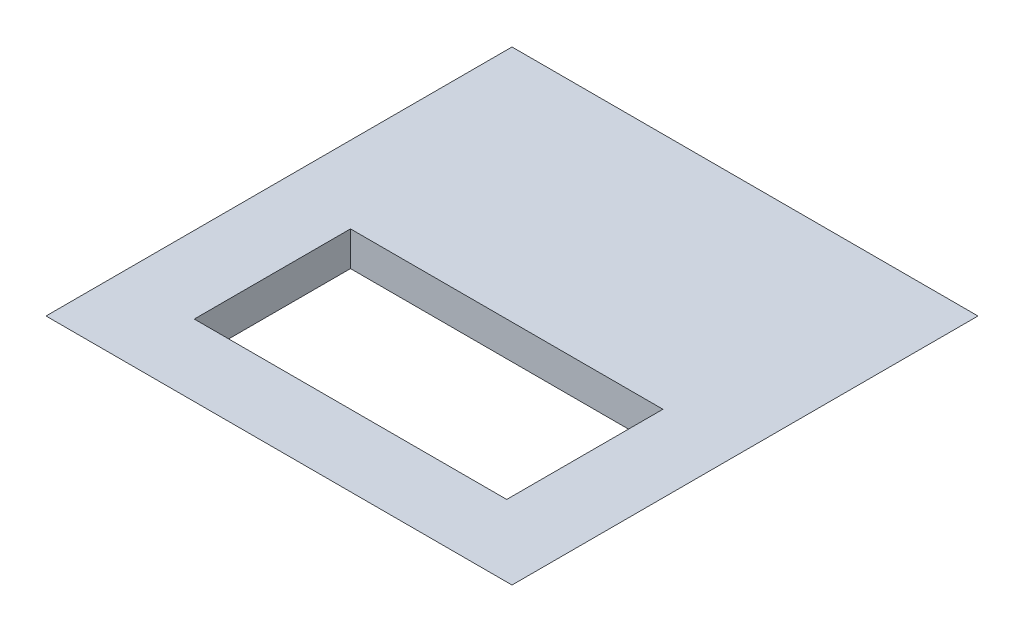
ISO-10303-21;
HEADER;
FILE_DESCRIPTION(('STEP AP214'),'2;1');
FILE_NAME('part.step','',(''),(''),'','','');
FILE_SCHEMA(('AUTOMOTIVE_DESIGN { 1 0 10303 214 1 1 1 1 }'));
ENDSEC;
DATA;
#1=APPLICATION_CONTEXT('core data for automotive mechanical design processes');
#2=APPLICATION_PROTOCOL_DEFINITION('international standard','automotive_design',2000,#1);
#3=PRODUCT_CONTEXT('',#1,'mechanical');
#4=PRODUCT('Part','Part','',(#3));
#5=PRODUCT_RELATED_PRODUCT_CATEGORY('part','',(#4));
#6=PRODUCT_DEFINITION_FORMATION('','',#4);
#7=PRODUCT_DEFINITION_CONTEXT('part definition',#1,'design');
#8=PRODUCT_DEFINITION('design','',#6,#7);
#9=PRODUCT_DEFINITION_SHAPE('','',#8);
#10=(LENGTH_UNIT() NAMED_UNIT(*) SI_UNIT(.MILLI.,.METRE.));
#11=(NAMED_UNIT(*) PLANE_ANGLE_UNIT() SI_UNIT($,.RADIAN.));
#12=(NAMED_UNIT(*) SI_UNIT($,.STERADIAN.) SOLID_ANGLE_UNIT());
#13=UNCERTAINTY_MEASURE_WITH_UNIT(LENGTH_MEASURE(1.E-05),#10,'distance_accuracy_value','');
#14=(GEOMETRIC_REPRESENTATION_CONTEXT(3) GLOBAL_UNCERTAINTY_ASSIGNED_CONTEXT((#13)) GLOBAL_UNIT_ASSIGNED_CONTEXT((#10,
#11,#12)) REPRESENTATION_CONTEXT('',''));
#15=CARTESIAN_POINT('',(0.,0.,0.));
#16=DIRECTION('',(0.,0.,1.));
#17=DIRECTION('',(1.,0.,0.));
#18=AXIS2_PLACEMENT_3D('',#15,#16,#17);
#19=CARTESIAN_POINT('',(0.,0.,0.));
#20=DIRECTION('',(-0.707106781186546,-0.707106781186549,0.));
#21=DIRECTION('',(0.707106781186549,-0.707106781186546,0.));
#22=AXIS2_PLACEMENT_3D('',#19,#20,#21);
#23=PLANE('',#22);
#24=DIRECTION('',(0.,0.,1.));
#25=VECTOR('',#24,1.);
#26=CARTESIAN_POINT('',(0.,0.,0.));
#27=LINE('',#26,#25);
#28=CARTESIAN_POINT('',(0.,0.,-150.));
#29=VERTEX_POINT('',#28);
#30=CARTESIAN_POINT('',(0.,0.,0.));
#31=VERTEX_POINT('',#30);
#32=EDGE_CURVE('E132',#29,#31,#27,.T.);
#33=ORIENTED_EDGE('',*,*,#32,.T.);
#34=DIRECTION('',(0.577350269189627,-0.577350269189624,-0.577350269189627));
#35=VECTOR('',#34,1.);
#36=CARTESIAN_POINT('',(0.,0.,0.));
#37=LINE('',#36,#35);
#38=CARTESIAN_POINT('',(-13.,13.,13.));
#39=VERTEX_POINT('',#38);
#40=EDGE_CURVE('E11',#39,#31,#37,.T.);
#41=ORIENTED_EDGE('',*,*,#40,.F.);
#42=DIRECTION('',(0.,0.,-1.));
#43=VECTOR('',#42,1.);
#44=CARTESIAN_POINT('',(-13.,13.,0.));
#45=LINE('',#44,#43);
#46=CARTESIAN_POINT('',(-13.,13.,-163.));
#47=VERTEX_POINT('',#46);
#48=EDGE_CURVE('E143',#47,#39,#45,.F.);
#49=ORIENTED_EDGE('',*,*,#48,.F.);
#50=DIRECTION('',(0.577350269189627,-0.577350269189624,0.577350269189627));
#51=VECTOR('',#50,1.);
#52=CARTESIAN_POINT('',(50.0000000000001,-49.9999999999999,-99.9999999999999));
#53=LINE('',#52,#51);
#54=EDGE_CURVE('E145',#47,#29,#53,.T.);
#55=ORIENTED_EDGE('',*,*,#54,.T.);
#56=EDGE_LOOP('',(#33,#41,#49,#55));
#57=FACE_BOUND('',#56,.T.);
#58=ADVANCED_FACE('F32',(#57),#23,.T.);
#59=CARTESIAN_POINT('',(0.,0.,0.));
#60=DIRECTION('',(0.,-0.707106781186549,0.707106781186546));
#61=DIRECTION('',(0.,-0.707106781186546,-0.707106781186549));
#62=AXIS2_PLACEMENT_3D('',#59,#60,#61);
#63=PLANE('',#62);
#64=DIRECTION('',(1.,0.,0.));
#65=VECTOR('',#64,1.);
#66=CARTESIAN_POINT('',(0.,0.,0.));
#67=LINE('',#66,#65);
#68=CARTESIAN_POINT('',(150.,0.,0.));
#69=VERTEX_POINT('',#68);
#70=EDGE_CURVE('E138',#31,#69,#67,.T.);
#71=ORIENTED_EDGE('',*,*,#70,.T.);
#72=DIRECTION('',(-0.577350269189627,-0.577350269189624,-0.577350269189627));
#73=VECTOR('',#72,1.);
#74=CARTESIAN_POINT('',(150.,0.,0.));
#75=LINE('',#74,#73);
#76=CARTESIAN_POINT('',(163.,13.,13.));
#77=VERTEX_POINT('',#76);
#78=EDGE_CURVE('E41',#77,#69,#75,.T.);
#79=ORIENTED_EDGE('',*,*,#78,.F.);
#80=DIRECTION('',(-1.,0.,0.));
#81=VECTOR('',#80,1.);
#82=CARTESIAN_POINT('',(0.,13.,13.));
#83=LINE('',#82,#81);
#84=EDGE_CURVE('E155',#39,#77,#83,.F.);
#85=ORIENTED_EDGE('',*,*,#84,.F.);
#86=ORIENTED_EDGE('',*,*,#40,.T.);
#87=EDGE_LOOP('',(#71,#79,#85,#86));
#88=FACE_BOUND('',#87,.T.);
#89=ADVANCED_FACE('F34',(#88),#63,.T.);
#90=CARTESIAN_POINT('',(150.,0.,0.));
#91=DIRECTION('',(0.707106781186546,-0.707106781186549,0.));
#92=DIRECTION('',(0.707106781186549,0.707106781186546,0.));
#93=AXIS2_PLACEMENT_3D('',#90,#91,#92);
#94=PLANE('',#93);
#95=DIRECTION('',(0.,0.,-1.));
#96=VECTOR('',#95,1.);
#97=CARTESIAN_POINT('',(150.,0.,0.));
#98=LINE('',#97,#96);
#99=CARTESIAN_POINT('',(150.,0.,-150.));
#100=VERTEX_POINT('',#99);
#101=EDGE_CURVE('E140',#69,#100,#98,.T.);
#102=ORIENTED_EDGE('',*,*,#101,.T.);
#103=DIRECTION('',(-0.577350269189627,-0.577350269189624,0.577350269189627));
#104=VECTOR('',#103,1.);
#105=CARTESIAN_POINT('',(99.9999999999999,-49.9999999999999,-99.9999999999999));
#106=LINE('',#105,#104);
#107=CARTESIAN_POINT('',(163.,13.,-163.));
#108=VERTEX_POINT('',#107);
#109=EDGE_CURVE('E148',#108,#100,#106,.T.);
#110=ORIENTED_EDGE('',*,*,#109,.F.);
#111=DIRECTION('',(0.,0.,1.));
#112=VECTOR('',#111,1.);
#113=CARTESIAN_POINT('',(163.,13.,0.));
#114=LINE('',#113,#112);
#115=EDGE_CURVE('E156',#77,#108,#114,.F.);
#116=ORIENTED_EDGE('',*,*,#115,.F.);
#117=ORIENTED_EDGE('',*,*,#78,.T.);
#118=EDGE_LOOP('',(#102,#110,#116,#117));
#119=FACE_BOUND('',#118,.T.);
#120=ADVANCED_FACE('F174',(#119),#94,.T.);
#121=CARTESIAN_POINT('',(0.,0.,-150.));
#122=DIRECTION('',(0.,-0.707106781186549,-0.707106781186546));
#123=DIRECTION('',(0.,0.707106781186546,-0.707106781186549));
#124=AXIS2_PLACEMENT_3D('',#121,#122,#123);
#125=PLANE('',#124);
#126=DIRECTION('',(-1.,0.,0.));
#127=VECTOR('',#126,1.);
#128=CARTESIAN_POINT('',(0.,0.,-150.));
#129=LINE('',#128,#127);
#130=EDGE_CURVE('E142',#100,#29,#129,.T.);
#131=ORIENTED_EDGE('',*,*,#130,.T.);
#132=ORIENTED_EDGE('',*,*,#54,.F.);
#133=DIRECTION('',(1.,0.,0.));
#134=VECTOR('',#133,1.);
#135=CARTESIAN_POINT('',(0.,13.,-163.));
#136=LINE('',#135,#134);
#137=EDGE_CURVE('E36',#108,#47,#136,.F.);
#138=ORIENTED_EDGE('',*,*,#137,.F.);
#139=ORIENTED_EDGE('',*,*,#109,.T.);
#140=EDGE_LOOP('',(#131,#132,#138,#139));
#141=FACE_BOUND('',#140,.T.);
#142=ADVANCED_FACE('F166',(#141),#125,.T.);
#143=CARTESIAN_POINT('',(0.,13.,0.));
#144=DIRECTION('',(0.,-1.,0.));
#145=DIRECTION('',(0.,0.,-1.));
#146=AXIS2_PLACEMENT_3D('',#143,#144,#145);
#147=PLANE('',#146);
#148=DIRECTION('',(1.,0.,0.));
#149=VECTOR('',#148,1.);
#150=CARTESIAN_POINT('',(16.,13.,-14.));
#151=LINE('',#150,#149);
#152=CARTESIAN_POINT('',(16.,13.,-14.));
#153=VERTEX_POINT('',#152);
#154=CARTESIAN_POINT('',(134.,13.,-14.));
#155=VERTEX_POINT('',#154);
#156=EDGE_CURVE('E126',#153,#155,#151,.T.);
#157=ORIENTED_EDGE('',*,*,#156,.F.);
#158=DIRECTION('',(0.,0.,1.));
#159=VECTOR('',#158,1.);
#160=CARTESIAN_POINT('',(16.,13.,-72.9999999999999));
#161=LINE('',#160,#159);
#162=CARTESIAN_POINT('',(16.,13.,-72.9999999999999));
#163=VERTEX_POINT('',#162);
#164=EDGE_CURVE('E49',#163,#153,#161,.T.);
#165=ORIENTED_EDGE('',*,*,#164,.F.);
#166=DIRECTION('',(-1.,0.,0.));
#167=VECTOR('',#166,1.);
#168=CARTESIAN_POINT('',(16.,13.,-72.9999999999999));
#169=LINE('',#168,#167);
#170=CARTESIAN_POINT('',(134.,13.,-72.9999999999999));
#171=VERTEX_POINT('',#170);
#172=EDGE_CURVE('E117',#171,#163,#169,.T.);
#173=ORIENTED_EDGE('',*,*,#172,.F.);
#174=DIRECTION('',(0.,0.,-1.));
#175=VECTOR('',#174,1.);
#176=CARTESIAN_POINT('',(134.,13.,-72.9999999999999));
#177=LINE('',#176,#175);
#178=EDGE_CURVE('E120',#155,#171,#177,.T.);
#179=ORIENTED_EDGE('',*,*,#178,.F.);
#180=EDGE_LOOP('',(#157,#165,#173,#179));
#181=FACE_BOUND('',#180,.T.);
#182=ORIENTED_EDGE('',*,*,#48,.T.);
#183=ORIENTED_EDGE('',*,*,#84,.T.);
#184=ORIENTED_EDGE('',*,*,#115,.T.);
#185=ORIENTED_EDGE('',*,*,#137,.T.);
#186=EDGE_LOOP('',(#182,#183,#184,#185));
#187=FACE_BOUND('',#186,.T.);
#188=ADVANCED_FACE('F162',(#181,#187),#147,.F.);
#189=CARTESIAN_POINT('',(0.,0.,0.));
#190=DIRECTION('',(0.,-1.,0.));
#191=DIRECTION('',(0.,0.,-1.));
#192=AXIS2_PLACEMENT_3D('',#189,#190,#191);
#193=PLANE('',#192);
#194=DIRECTION('',(0.,0.,1.));
#195=VECTOR('',#194,1.);
#196=CARTESIAN_POINT('',(16.,0.,-72.9999999999999));
#197=LINE('',#196,#195);
#198=CARTESIAN_POINT('',(16.,0.,-72.9999999999999));
#199=VERTEX_POINT('',#198);
#200=CARTESIAN_POINT('',(16.,0.,-14.));
#201=VERTEX_POINT('',#200);
#202=EDGE_CURVE('E101',#199,#201,#197,.T.);
#203=ORIENTED_EDGE('',*,*,#202,.T.);
#204=DIRECTION('',(1.,0.,0.));
#205=VECTOR('',#204,1.);
#206=CARTESIAN_POINT('',(16.,0.,-14.));
#207=LINE('',#206,#205);
#208=CARTESIAN_POINT('',(134.,0.,-14.));
#209=VERTEX_POINT('',#208);
#210=EDGE_CURVE('E110',#201,#209,#207,.T.);
#211=ORIENTED_EDGE('',*,*,#210,.T.);
#212=DIRECTION('',(0.,0.,-1.));
#213=VECTOR('',#212,1.);
#214=CARTESIAN_POINT('',(134.,0.,-72.9999999999999));
#215=LINE('',#214,#213);
#216=CARTESIAN_POINT('',(134.,0.,-72.9999999999999));
#217=VERTEX_POINT('',#216);
#218=EDGE_CURVE('E57',#209,#217,#215,.T.);
#219=ORIENTED_EDGE('',*,*,#218,.T.);
#220=DIRECTION('',(-1.,0.,0.));
#221=VECTOR('',#220,1.);
#222=CARTESIAN_POINT('',(16.,0.,-72.9999999999999));
#223=LINE('',#222,#221);
#224=EDGE_CURVE('E107',#217,#199,#223,.T.);
#225=ORIENTED_EDGE('',*,*,#224,.T.);
#226=EDGE_LOOP('',(#203,#211,#219,#225));
#227=FACE_BOUND('',#226,.T.);
#228=ORIENTED_EDGE('',*,*,#32,.F.);
#229=ORIENTED_EDGE('',*,*,#130,.F.);
#230=ORIENTED_EDGE('',*,*,#101,.F.);
#231=ORIENTED_EDGE('',*,*,#70,.F.);
#232=EDGE_LOOP('',(#228,#229,#230,#231));
#233=FACE_BOUND('',#232,.T.);
#234=ADVANCED_FACE('F114',(#227,#233),#193,.T.);
#235=CARTESIAN_POINT('',(16.,0.,-72.9999999999999));
#236=DIRECTION('',(-1.,0.,0.));
#237=DIRECTION('',(0.,0.,1.));
#238=AXIS2_PLACEMENT_3D('',#235,#236,#237);
#239=PLANE('',#238);
#240=ORIENTED_EDGE('',*,*,#164,.T.);
#241=DIRECTION('',(0.,1.,0.));
#242=VECTOR('',#241,1.);
#243=CARTESIAN_POINT('',(16.,0.,-14.));
#244=LINE('',#243,#242);
#245=EDGE_CURVE('E97',#201,#153,#244,.T.);
#246=ORIENTED_EDGE('',*,*,#245,.F.);
#247=ORIENTED_EDGE('',*,*,#202,.F.);
#248=DIRECTION('',(0.,1.,0.));
#249=VECTOR('',#248,1.);
#250=CARTESIAN_POINT('',(16.,0.,-72.9999999999999));
#251=LINE('',#250,#249);
#252=EDGE_CURVE('E130',#199,#163,#251,.T.);
#253=ORIENTED_EDGE('',*,*,#252,.T.);
#254=EDGE_LOOP('',(#240,#246,#247,#253));
#255=FACE_BOUND('',#254,.T.);
#256=ADVANCED_FACE('F99',(#255),#239,.F.);
#257=CARTESIAN_POINT('',(16.,0.,-72.9999999999999));
#258=DIRECTION('',(0.,0.,-1.));
#259=DIRECTION('',(-1.,0.,0.));
#260=AXIS2_PLACEMENT_3D('',#257,#258,#259);
#261=PLANE('',#260);
#262=ORIENTED_EDGE('',*,*,#172,.T.);
#263=ORIENTED_EDGE('',*,*,#252,.F.);
#264=ORIENTED_EDGE('',*,*,#224,.F.);
#265=DIRECTION('',(0.,1.,0.));
#266=VECTOR('',#265,1.);
#267=CARTESIAN_POINT('',(134.,0.,-72.9999999999999));
#268=LINE('',#267,#266);
#269=EDGE_CURVE('E133',#217,#171,#268,.T.);
#270=ORIENTED_EDGE('',*,*,#269,.T.);
#271=EDGE_LOOP('',(#262,#263,#264,#270));
#272=FACE_BOUND('',#271,.T.);
#273=ADVANCED_FACE('F181',(#272),#261,.F.);
#274=CARTESIAN_POINT('',(134.,0.,-72.9999999999999));
#275=DIRECTION('',(1.,0.,0.));
#276=DIRECTION('',(0.,0.,-1.));
#277=AXIS2_PLACEMENT_3D('',#274,#275,#276);
#278=PLANE('',#277);
#279=ORIENTED_EDGE('',*,*,#178,.T.);
#280=ORIENTED_EDGE('',*,*,#269,.F.);
#281=ORIENTED_EDGE('',*,*,#218,.F.);
#282=DIRECTION('',(0.,1.,0.));
#283=VECTOR('',#282,1.);
#284=CARTESIAN_POINT('',(134.,0.,-14.));
#285=LINE('',#284,#283);
#286=EDGE_CURVE('E106',#209,#155,#285,.T.);
#287=ORIENTED_EDGE('',*,*,#286,.T.);
#288=EDGE_LOOP('',(#279,#280,#281,#287));
#289=FACE_BOUND('',#288,.T.);
#290=ADVANCED_FACE('F224',(#289),#278,.F.);
#291=CARTESIAN_POINT('',(16.,0.,-14.));
#292=DIRECTION('',(0.,0.,1.));
#293=DIRECTION('',(1.,0.,0.));
#294=AXIS2_PLACEMENT_3D('',#291,#292,#293);
#295=PLANE('',#294);
#296=ORIENTED_EDGE('',*,*,#156,.T.);
#297=ORIENTED_EDGE('',*,*,#286,.F.);
#298=ORIENTED_EDGE('',*,*,#210,.F.);
#299=ORIENTED_EDGE('',*,*,#245,.T.);
#300=EDGE_LOOP('',(#296,#297,#298,#299));
#301=FACE_BOUND('',#300,.T.);
#302=ADVANCED_FACE('F111',(#301),#295,.F.);
#303=CLOSED_SHELL('',(#58,#89,#120,#142,#188,#234,#256,#273,#290,#302));
#304=MANIFOLD_SOLID_BREP('B2',#303);
#305=ADVANCED_BREP_SHAPE_REPRESENTATION('',(#18,#304),#14);
#306=SHAPE_DEFINITION_REPRESENTATION(#9,#305);
ENDSEC;
END-ISO-10303-21;
